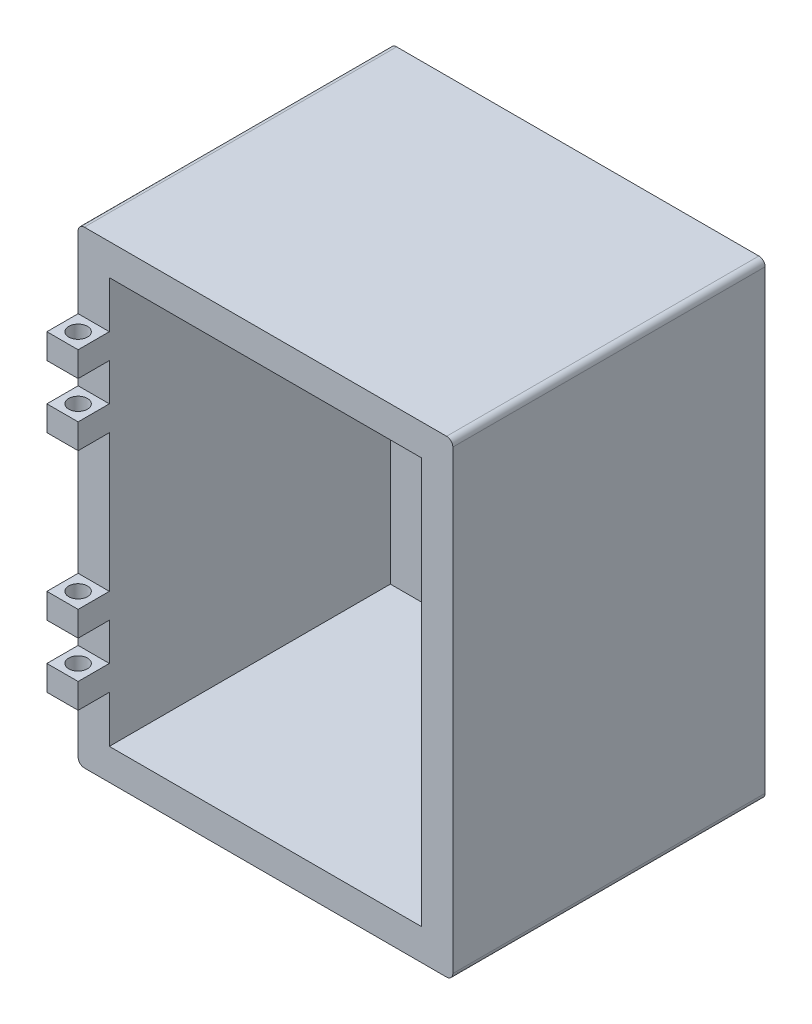
ISO-10303-21;
HEADER;
FILE_DESCRIPTION(('STEP AP214'),'2;1');
FILE_NAME('part.step','',(''),(''),'','','');
FILE_SCHEMA(('AUTOMOTIVE_DESIGN { 1 0 10303 214 1 1 1 1 }'));
ENDSEC;
DATA;
#1=APPLICATION_CONTEXT('core data for automotive mechanical design processes');
#2=APPLICATION_PROTOCOL_DEFINITION('international standard','automotive_design',2000,#1);
#3=PRODUCT_CONTEXT('',#1,'mechanical');
#4=PRODUCT('Part','Part','',(#3));
#5=PRODUCT_RELATED_PRODUCT_CATEGORY('part','',(#4));
#6=PRODUCT_DEFINITION_FORMATION('','',#4);
#7=PRODUCT_DEFINITION_CONTEXT('part definition',#1,'design');
#8=PRODUCT_DEFINITION('design','',#6,#7);
#9=PRODUCT_DEFINITION_SHAPE('','',#8);
#10=(LENGTH_UNIT() NAMED_UNIT(*) SI_UNIT(.MILLI.,.METRE.));
#11=(NAMED_UNIT(*) PLANE_ANGLE_UNIT() SI_UNIT($,.RADIAN.));
#12=(NAMED_UNIT(*) SI_UNIT($,.STERADIAN.) SOLID_ANGLE_UNIT());
#13=UNCERTAINTY_MEASURE_WITH_UNIT(LENGTH_MEASURE(1.E-05),#10,'distance_accuracy_value','');
#14=(GEOMETRIC_REPRESENTATION_CONTEXT(3) GLOBAL_UNCERTAINTY_ASSIGNED_CONTEXT((#13)) GLOBAL_UNIT_ASSIGNED_CONTEXT((#10,
#11,#12)) REPRESENTATION_CONTEXT('',''));
#15=CARTESIAN_POINT('',(0.,0.,0.));
#16=DIRECTION('',(0.,0.,1.));
#17=DIRECTION('',(1.,0.,0.));
#18=AXIS2_PLACEMENT_3D('',#15,#16,#17);
#19=CARTESIAN_POINT('',(0.,0.,100.));
#20=DIRECTION('',(0.,0.,-1.));
#21=DIRECTION('',(-1.,0.,0.));
#22=AXIS2_PLACEMENT_3D('',#19,#20,#21);
#23=PLANE('',#22);
#24=DIRECTION('',(-1.,0.,0.));
#25=VECTOR('',#24,1.);
#26=CARTESIAN_POINT('',(0.,53.,100.));
#27=LINE('',#26,#25);
#28=CARTESIAN_POINT('',(9.99999999999999,53.,100.));
#29=VERTEX_POINT('',#28);
#30=CARTESIAN_POINT('',(0.,53.,100.));
#31=VERTEX_POINT('',#30);
#32=EDGE_CURVE('E232',#29,#31,#27,.T.);
#33=ORIENTED_EDGE('',*,*,#32,.F.);
#34=DIRECTION('',(0.,-1.,0.));
#35=VECTOR('',#34,1.);
#36=CARTESIAN_POINT('',(10.,0.,100.));
#37=LINE('',#36,#35);
#38=CARTESIAN_POINT('',(9.99999999999999,97.,100.));
#39=VERTEX_POINT('',#38);
#40=EDGE_CURVE('E243',#39,#29,#37,.T.);
#41=ORIENTED_EDGE('',*,*,#40,.F.);
#42=DIRECTION('',(1.,0.,0.));
#43=VECTOR('',#42,1.);
#44=CARTESIAN_POINT('',(0.,97.,100.));
#45=LINE('',#44,#43);
#46=CARTESIAN_POINT('',(0.,97.,100.));
#47=VERTEX_POINT('',#46);
#48=EDGE_CURVE('E394',#47,#39,#45,.T.);
#49=ORIENTED_EDGE('',*,*,#48,.F.);
#50=DIRECTION('',(0.,-1.,0.));
#51=VECTOR('',#50,1.);
#52=CARTESIAN_POINT('',(0.,0.,100.));
#53=LINE('',#52,#51);
#54=EDGE_CURVE('E246',#47,#31,#53,.T.);
#55=ORIENTED_EDGE('',*,*,#54,.T.);
#56=EDGE_LOOP('',(#33,#41,#49,#55));
#57=FACE_BOUND('',#56,.T.);
#58=ADVANCED_FACE('F41',(#57),#23,.F.);
#59=DIRECTION('',(1.,0.,0.));
#60=VECTOR('',#59,1.);
#61=CARTESIAN_POINT('',(0.,45.,100.));
#62=LINE('',#61,#60);
#63=CARTESIAN_POINT('',(0.,45.,100.));
#64=VERTEX_POINT('',#63);
#65=CARTESIAN_POINT('',(10.,45.,100.));
#66=VERTEX_POINT('',#65);
#67=EDGE_CURVE('E248',#64,#66,#62,.T.);
#68=ORIENTED_EDGE('',*,*,#67,.F.);
#69=CARTESIAN_POINT('',(0.,33.,100.));
#70=VERTEX_POINT('',#69);
#71=EDGE_CURVE('E284',#64,#70,#53,.T.);
#72=ORIENTED_EDGE('',*,*,#71,.T.);
#73=DIRECTION('',(-1.,0.,0.));
#74=VECTOR('',#73,1.);
#75=CARTESIAN_POINT('',(0.,33.,100.));
#76=LINE('',#75,#74);
#77=CARTESIAN_POINT('',(9.99999999999999,33.,100.));
#78=VERTEX_POINT('',#77);
#79=EDGE_CURVE('E502',#78,#70,#76,.T.);
#80=ORIENTED_EDGE('',*,*,#79,.F.);
#81=EDGE_CURVE('E257',#66,#78,#37,.T.);
#82=ORIENTED_EDGE('',*,*,#81,.F.);
#83=EDGE_LOOP('',(#68,#72,#80,#82));
#84=FACE_BOUND('',#83,.T.);
#85=ADVANCED_FACE('F470',(#84),#23,.F.);
#86=DIRECTION('',(1.,0.,0.));
#87=VECTOR('',#86,1.);
#88=CARTESIAN_POINT('',(0.,0.,100.));
#89=LINE('',#88,#87);
#90=CARTESIAN_POINT('',(2.,0.,100.));
#91=VERTEX_POINT('',#90);
#92=CARTESIAN_POINT('',(118.,0.,100.));
#93=VERTEX_POINT('',#92);
#94=EDGE_CURVE('E282',#91,#93,#89,.T.);
#95=ORIENTED_EDGE('',*,*,#94,.T.);
#96=CARTESIAN_POINT('',(118.,2.,100.));
#97=DIRECTION('',(0.,0.,-1.));
#98=DIRECTION('',(-1.,0.,0.));
#99=AXIS2_PLACEMENT_3D('',#96,#97,#98);
#100=CIRCLE('',#99,2.);
#101=CARTESIAN_POINT('',(120.,2.,100.));
#102=VERTEX_POINT('',#101);
#103=EDGE_CURVE('E333',#93,#102,#100,.F.);
#104=ORIENTED_EDGE('',*,*,#103,.T.);
#105=DIRECTION('',(0.,1.,0.));
#106=VECTOR('',#105,1.);
#107=CARTESIAN_POINT('',(120.,0.,100.));
#108=LINE('',#107,#106);
#109=CARTESIAN_POINT('',(120.,148.,100.));
#110=VERTEX_POINT('',#109);
#111=EDGE_CURVE('E287',#102,#110,#108,.T.);
#112=ORIENTED_EDGE('',*,*,#111,.T.);
#113=CARTESIAN_POINT('',(118.,148.,100.));
#114=DIRECTION('',(0.,0.,-1.));
#115=DIRECTION('',(-1.,0.,0.));
#116=AXIS2_PLACEMENT_3D('',#113,#114,#115);
#117=CIRCLE('',#116,2.);
#118=CARTESIAN_POINT('',(118.,150.,100.));
#119=VERTEX_POINT('',#118);
#120=EDGE_CURVE('E329',#110,#119,#117,.F.);
#121=ORIENTED_EDGE('',*,*,#120,.T.);
#122=DIRECTION('',(-1.,0.,0.));
#123=VECTOR('',#122,1.);
#124=CARTESIAN_POINT('',(0.,150.,100.));
#125=LINE('',#124,#123);
#126=CARTESIAN_POINT('',(2.,150.,100.));
#127=VERTEX_POINT('',#126);
#128=EDGE_CURVE('E290',#119,#127,#125,.T.);
#129=ORIENTED_EDGE('',*,*,#128,.T.);
#130=CARTESIAN_POINT('',(2.,148.,100.));
#131=DIRECTION('',(0.,0.,-1.));
#132=DIRECTION('',(-1.,0.,0.));
#133=AXIS2_PLACEMENT_3D('',#130,#131,#132);
#134=CIRCLE('',#133,2.);
#135=CARTESIAN_POINT('',(0.,148.,100.));
#136=VERTEX_POINT('',#135);
#137=EDGE_CURVE('E56',#127,#136,#134,.F.);
#138=ORIENTED_EDGE('',*,*,#137,.T.);
#139=CARTESIAN_POINT('',(0.,125.,100.));
#140=VERTEX_POINT('',#139);
#141=EDGE_CURVE('E280',#136,#140,#53,.T.);
#142=ORIENTED_EDGE('',*,*,#141,.T.);
#143=DIRECTION('',(-1.,0.,0.));
#144=VECTOR('',#143,1.);
#145=CARTESIAN_POINT('',(0.,125.,100.));
#146=LINE('',#145,#144);
#147=CARTESIAN_POINT('',(9.99999999999999,125.,100.));
#148=VERTEX_POINT('',#147);
#149=EDGE_CURVE('E385',#148,#140,#146,.T.);
#150=ORIENTED_EDGE('',*,*,#149,.F.);
#151=CARTESIAN_POINT('',(10.,140.,100.));
#152=VERTEX_POINT('',#151);
#153=EDGE_CURVE('E259',#152,#148,#37,.T.);
#154=ORIENTED_EDGE('',*,*,#153,.F.);
#155=DIRECTION('',(-1.,0.,0.));
#156=VECTOR('',#155,1.);
#157=CARTESIAN_POINT('',(0.,140.,100.));
#158=LINE('',#157,#156);
#159=CARTESIAN_POINT('',(110.,140.,100.));
#160=VERTEX_POINT('',#159);
#161=EDGE_CURVE('E275',#160,#152,#158,.T.);
#162=ORIENTED_EDGE('',*,*,#161,.F.);
#163=DIRECTION('',(0.,1.,0.));
#164=VECTOR('',#163,1.);
#165=CARTESIAN_POINT('',(110.,0.,100.));
#166=LINE('',#165,#164);
#167=CARTESIAN_POINT('',(110.,10.,100.));
#168=VERTEX_POINT('',#167);
#169=EDGE_CURVE('E268',#168,#160,#166,.T.);
#170=ORIENTED_EDGE('',*,*,#169,.F.);
#171=DIRECTION('',(1.,0.,0.));
#172=VECTOR('',#171,1.);
#173=CARTESIAN_POINT('',(0.,10.,100.));
#174=LINE('',#173,#172);
#175=CARTESIAN_POINT('',(10.,10.,100.));
#176=VERTEX_POINT('',#175);
#177=EDGE_CURVE('E264',#176,#168,#174,.T.);
#178=ORIENTED_EDGE('',*,*,#177,.F.);
#179=CARTESIAN_POINT('',(10.,25.,100.));
#180=VERTEX_POINT('',#179);
#181=EDGE_CURVE('E260',#180,#176,#37,.T.);
#182=ORIENTED_EDGE('',*,*,#181,.F.);
#183=DIRECTION('',(1.,0.,0.));
#184=VECTOR('',#183,1.);
#185=CARTESIAN_POINT('',(0.,25.,100.));
#186=LINE('',#185,#184);
#187=CARTESIAN_POINT('',(0.,25.,100.));
#188=VERTEX_POINT('',#187);
#189=EDGE_CURVE('E353',#188,#180,#186,.T.);
#190=ORIENTED_EDGE('',*,*,#189,.F.);
#191=CARTESIAN_POINT('',(0.,2.,100.));
#192=VERTEX_POINT('',#191);
#193=EDGE_CURVE('E305',#188,#192,#53,.T.);
#194=ORIENTED_EDGE('',*,*,#193,.T.);
#195=CARTESIAN_POINT('',(2.,2.,100.));
#196=DIRECTION('',(0.,0.,-1.));
#197=DIRECTION('',(-1.,0.,0.));
#198=AXIS2_PLACEMENT_3D('',#195,#196,#197);
#199=CIRCLE('',#198,2.);
#200=EDGE_CURVE('E331',#192,#91,#199,.F.);
#201=ORIENTED_EDGE('',*,*,#200,.T.);
#202=EDGE_LOOP('',(#95,#104,#112,#121,#129,#138,#142,#150,#154,#162,#170,#178,#182,#190,#194,#201));
#203=FACE_BOUND('',#202,.T.);
#204=ADVANCED_FACE('F349',(#203),#23,.F.);
#205=DIRECTION('',(1.,0.,0.));
#206=VECTOR('',#205,1.);
#207=CARTESIAN_POINT('',(0.,117.,100.));
#208=LINE('',#207,#206);
#209=CARTESIAN_POINT('',(0.,117.,100.));
#210=VERTEX_POINT('',#209);
#211=CARTESIAN_POINT('',(10.,117.,100.));
#212=VERTEX_POINT('',#211);
#213=EDGE_CURVE('E390',#210,#212,#208,.T.);
#214=ORIENTED_EDGE('',*,*,#213,.F.);
#215=CARTESIAN_POINT('',(0.,105.,100.));
#216=VERTEX_POINT('',#215);
#217=EDGE_CURVE('E283',#210,#216,#53,.T.);
#218=ORIENTED_EDGE('',*,*,#217,.T.);
#219=DIRECTION('',(-1.,0.,0.));
#220=VECTOR('',#219,1.);
#221=CARTESIAN_POINT('',(0.,105.,100.));
#222=LINE('',#221,#220);
#223=CARTESIAN_POINT('',(10.,105.,100.));
#224=VERTEX_POINT('',#223);
#225=EDGE_CURVE('E411',#224,#216,#222,.T.);
#226=ORIENTED_EDGE('',*,*,#225,.F.);
#227=EDGE_CURVE('E256',#212,#224,#37,.T.);
#228=ORIENTED_EDGE('',*,*,#227,.F.);
#229=EDGE_LOOP('',(#214,#218,#226,#228));
#230=FACE_BOUND('',#229,.T.);
#231=ADVANCED_FACE('F472',(#230),#23,.F.);
#232=CARTESIAN_POINT('',(0.,0.,100.));
#233=DIRECTION('',(1.,0.,0.));
#234=DIRECTION('',(0.,0.,-1.));
#235=AXIS2_PLACEMENT_3D('',#232,#233,#234);
#236=PLANE('',#235);
#237=DIRECTION('',(0.,-1.,0.));
#238=VECTOR('',#237,1.);
#239=CARTESIAN_POINT('',(0.,0.,0.));
#240=LINE('',#239,#238);
#241=CARTESIAN_POINT('',(0.,148.,0.));
#242=VERTEX_POINT('',#241);
#243=CARTESIAN_POINT('',(0.,2.,0.));
#244=VERTEX_POINT('',#243);
#245=EDGE_CURVE('E293',#242,#244,#240,.T.);
#246=ORIENTED_EDGE('',*,*,#245,.T.);
#247=DIRECTION('',(0.,0.,-1.));
#248=VECTOR('',#247,1.);
#249=CARTESIAN_POINT('',(0.,2.,100.));
#250=LINE('',#249,#248);
#251=EDGE_CURVE('E338',#244,#192,#250,.F.);
#252=ORIENTED_EDGE('',*,*,#251,.T.);
#253=ORIENTED_EDGE('',*,*,#193,.F.);
#254=DIRECTION('',(0.,0.,-1.));
#255=VECTOR('',#254,1.);
#256=CARTESIAN_POINT('',(0.,25.,110.));
#257=LINE('',#256,#255);
#258=CARTESIAN_POINT('',(0.,25.,110.));
#259=VERTEX_POINT('',#258);
#260=EDGE_CURVE('E510',#259,#188,#257,.T.);
#261=ORIENTED_EDGE('',*,*,#260,.F.);
#262=DIRECTION('',(0.,-1.,0.));
#263=VECTOR('',#262,1.);
#264=CARTESIAN_POINT('',(0.,33.,110.));
#265=LINE('',#264,#263);
#266=CARTESIAN_POINT('',(0.,33.,110.));
#267=VERTEX_POINT('',#266);
#268=EDGE_CURVE('E506',#267,#259,#265,.T.);
#269=ORIENTED_EDGE('',*,*,#268,.F.);
#270=DIRECTION('',(0.,0.,-1.));
#271=VECTOR('',#270,1.);
#272=CARTESIAN_POINT('',(0.,33.,110.));
#273=LINE('',#272,#271);
#274=EDGE_CURVE('E247',#267,#70,#273,.T.);
#275=ORIENTED_EDGE('',*,*,#274,.T.);
#276=ORIENTED_EDGE('',*,*,#71,.F.);
#277=DIRECTION('',(0.,0.,-1.));
#278=VECTOR('',#277,1.);
#279=CARTESIAN_POINT('',(0.,45.,110.));
#280=LINE('',#279,#278);
#281=CARTESIAN_POINT('',(0.,45.,110.));
#282=VERTEX_POINT('',#281);
#283=EDGE_CURVE('E834',#282,#64,#280,.T.);
#284=ORIENTED_EDGE('',*,*,#283,.F.);
#285=DIRECTION('',(0.,-1.,0.));
#286=VECTOR('',#285,1.);
#287=CARTESIAN_POINT('',(0.,53.,110.));
#288=LINE('',#287,#286);
#289=CARTESIAN_POINT('',(0.,53.,110.));
#290=VERTEX_POINT('',#289);
#291=EDGE_CURVE('E846',#290,#282,#288,.T.);
#292=ORIENTED_EDGE('',*,*,#291,.F.);
#293=DIRECTION('',(0.,0.,-1.));
#294=VECTOR('',#293,1.);
#295=CARTESIAN_POINT('',(0.,53.,110.));
#296=LINE('',#295,#294);
#297=EDGE_CURVE('E832',#290,#31,#296,.T.);
#298=ORIENTED_EDGE('',*,*,#297,.T.);
#299=ORIENTED_EDGE('',*,*,#54,.F.);
#300=DIRECTION('',(0.,0.,-1.));
#301=VECTOR('',#300,1.);
#302=CARTESIAN_POINT('',(0.,97.,110.));
#303=LINE('',#302,#301);
#304=CARTESIAN_POINT('',(0.,97.,110.));
#305=VERTEX_POINT('',#304);
#306=EDGE_CURVE('E427',#305,#47,#303,.T.);
#307=ORIENTED_EDGE('',*,*,#306,.F.);
#308=DIRECTION('',(0.,-1.,0.));
#309=VECTOR('',#308,1.);
#310=CARTESIAN_POINT('',(0.,97.,110.));
#311=LINE('',#310,#309);
#312=CARTESIAN_POINT('',(0.,105.,110.));
#313=VERTEX_POINT('',#312);
#314=EDGE_CURVE('E407',#313,#305,#311,.T.);
#315=ORIENTED_EDGE('',*,*,#314,.F.);
#316=DIRECTION('',(0.,0.,-1.));
#317=VECTOR('',#316,1.);
#318=CARTESIAN_POINT('',(0.,105.,110.));
#319=LINE('',#318,#317);
#320=EDGE_CURVE('E417',#313,#216,#319,.T.);
#321=ORIENTED_EDGE('',*,*,#320,.T.);
#322=ORIENTED_EDGE('',*,*,#217,.F.);
#323=DIRECTION('',(0.,0.,-1.));
#324=VECTOR('',#323,1.);
#325=CARTESIAN_POINT('',(0.,117.,110.));
#326=LINE('',#325,#324);
#327=CARTESIAN_POINT('',(0.,117.,110.));
#328=VERTEX_POINT('',#327);
#329=EDGE_CURVE('E493',#328,#210,#326,.T.);
#330=ORIENTED_EDGE('',*,*,#329,.F.);
#331=DIRECTION('',(0.,-1.,0.));
#332=VECTOR('',#331,1.);
#333=CARTESIAN_POINT('',(0.,117.,110.));
#334=LINE('',#333,#332);
#335=CARTESIAN_POINT('',(0.,125.,110.));
#336=VERTEX_POINT('',#335);
#337=EDGE_CURVE('E391',#336,#328,#334,.T.);
#338=ORIENTED_EDGE('',*,*,#337,.F.);
#339=DIRECTION('',(0.,0.,-1.));
#340=VECTOR('',#339,1.);
#341=CARTESIAN_POINT('',(0.,125.,110.));
#342=LINE('',#341,#340);
#343=EDGE_CURVE('E382',#336,#140,#342,.T.);
#344=ORIENTED_EDGE('',*,*,#343,.T.);
#345=ORIENTED_EDGE('',*,*,#141,.F.);
#346=DIRECTION('',(0.,0.,-1.));
#347=VECTOR('',#346,1.);
#348=CARTESIAN_POINT('',(0.,148.,100.));
#349=LINE('',#348,#347);
#350=EDGE_CURVE('E335',#136,#242,#349,.T.);
#351=ORIENTED_EDGE('',*,*,#350,.T.);
#352=EDGE_LOOP('',(#246,#252,#253,#261,#269,#275,#276,#284,#292,#298,#299,#307,#315,#321,#322,
#330,#338,#344,#345,#351));
#353=FACE_BOUND('',#352,.T.);
#354=ADVANCED_FACE('F343',(#353),#236,.F.);
#355=CARTESIAN_POINT('',(0.,0.,100.));
#356=DIRECTION('',(0.,1.,0.));
#357=DIRECTION('',(0.,0.,1.));
#358=AXIS2_PLACEMENT_3D('',#355,#356,#357);
#359=PLANE('',#358);
#360=DIRECTION('',(1.,0.,0.));
#361=VECTOR('',#360,1.);
#362=CARTESIAN_POINT('',(0.,0.,0.));
#363=LINE('',#362,#361);
#364=CARTESIAN_POINT('',(2.,0.,0.));
#365=VERTEX_POINT('',#364);
#366=CARTESIAN_POINT('',(118.,0.,0.));
#367=VERTEX_POINT('',#366);
#368=EDGE_CURVE('E296',#365,#367,#363,.T.);
#369=ORIENTED_EDGE('',*,*,#368,.T.);
#370=DIRECTION('',(0.,0.,-1.));
#371=VECTOR('',#370,1.);
#372=CARTESIAN_POINT('',(118.,0.,100.));
#373=LINE('',#372,#371);
#374=EDGE_CURVE('E326',#367,#93,#373,.F.);
#375=ORIENTED_EDGE('',*,*,#374,.T.);
#376=ORIENTED_EDGE('',*,*,#94,.F.);
#377=DIRECTION('',(0.,0.,-1.));
#378=VECTOR('',#377,1.);
#379=CARTESIAN_POINT('',(2.,0.,100.));
#380=LINE('',#379,#378);
#381=EDGE_CURVE('E323',#91,#365,#380,.T.);
#382=ORIENTED_EDGE('',*,*,#381,.T.);
#383=EDGE_LOOP('',(#369,#375,#376,#382));
#384=FACE_BOUND('',#383,.T.);
#385=ADVANCED_FACE('F358',(#384),#359,.F.);
#386=CARTESIAN_POINT('',(120.,0.,100.));
#387=DIRECTION('',(-1.,0.,0.));
#388=DIRECTION('',(0.,0.,1.));
#389=AXIS2_PLACEMENT_3D('',#386,#387,#388);
#390=PLANE('',#389);
#391=ORIENTED_EDGE('',*,*,#111,.F.);
#392=DIRECTION('',(0.,0.,-1.));
#393=VECTOR('',#392,1.);
#394=CARTESIAN_POINT('',(120.,2.,100.));
#395=LINE('',#394,#393);
#396=CARTESIAN_POINT('',(120.,2.,0.));
#397=VERTEX_POINT('',#396);
#398=EDGE_CURVE('E312',#102,#397,#395,.T.);
#399=ORIENTED_EDGE('',*,*,#398,.T.);
#400=DIRECTION('',(0.,1.,0.));
#401=VECTOR('',#400,1.);
#402=CARTESIAN_POINT('',(120.,0.,0.));
#403=LINE('',#402,#401);
#404=CARTESIAN_POINT('',(120.,148.,0.));
#405=VERTEX_POINT('',#404);
#406=EDGE_CURVE('E300',#397,#405,#403,.T.);
#407=ORIENTED_EDGE('',*,*,#406,.T.);
#408=DIRECTION('',(0.,0.,-1.));
#409=VECTOR('',#408,1.);
#410=CARTESIAN_POINT('',(120.,148.,100.));
#411=LINE('',#410,#409);
#412=EDGE_CURVE('E292',#405,#110,#411,.F.);
#413=ORIENTED_EDGE('',*,*,#412,.T.);
#414=EDGE_LOOP('',(#391,#399,#407,#413));
#415=FACE_BOUND('',#414,.T.);
#416=ADVANCED_FACE('F369',(#415),#390,.F.);
#417=CARTESIAN_POINT('',(0.,150.,100.));
#418=DIRECTION('',(0.,-1.,0.));
#419=DIRECTION('',(0.,0.,-1.));
#420=AXIS2_PLACEMENT_3D('',#417,#418,#419);
#421=PLANE('',#420);
#422=ORIENTED_EDGE('',*,*,#128,.F.);
#423=DIRECTION('',(0.,0.,-1.));
#424=VECTOR('',#423,1.);
#425=CARTESIAN_POINT('',(118.,150.,100.));
#426=LINE('',#425,#424);
#427=CARTESIAN_POINT('',(118.,150.,0.));
#428=VERTEX_POINT('',#427);
#429=EDGE_CURVE('E11',#119,#428,#426,.T.);
#430=ORIENTED_EDGE('',*,*,#429,.T.);
#431=DIRECTION('',(-1.,0.,0.));
#432=VECTOR('',#431,1.);
#433=CARTESIAN_POINT('',(0.,150.,0.));
#434=LINE('',#433,#432);
#435=CARTESIAN_POINT('',(2.,150.,0.));
#436=VERTEX_POINT('',#435);
#437=EDGE_CURVE('E303',#428,#436,#434,.T.);
#438=ORIENTED_EDGE('',*,*,#437,.T.);
#439=DIRECTION('',(0.,0.,-1.));
#440=VECTOR('',#439,1.);
#441=CARTESIAN_POINT('',(2.,150.,100.));
#442=LINE('',#441,#440);
#443=EDGE_CURVE('E49',#436,#127,#442,.F.);
#444=ORIENTED_EDGE('',*,*,#443,.T.);
#445=EDGE_LOOP('',(#422,#430,#438,#444));
#446=FACE_BOUND('',#445,.T.);
#447=ADVANCED_FACE('F376',(#446),#421,.F.);
#448=CARTESIAN_POINT('',(0.,0.,0.));
#449=DIRECTION('',(0.,0.,-1.));
#450=DIRECTION('',(-1.,0.,0.));
#451=AXIS2_PLACEMENT_3D('',#448,#449,#450);
#452=PLANE('',#451);
#453=ORIENTED_EDGE('',*,*,#406,.F.);
#454=CARTESIAN_POINT('',(118.,2.,0.));
#455=DIRECTION('',(0.,0.,-1.));
#456=DIRECTION('',(-1.,0.,0.));
#457=AXIS2_PLACEMENT_3D('',#454,#455,#456);
#458=CIRCLE('',#457,2.);
#459=EDGE_CURVE('E321',#397,#367,#458,.T.);
#460=ORIENTED_EDGE('',*,*,#459,.T.);
#461=ORIENTED_EDGE('',*,*,#368,.F.);
#462=CARTESIAN_POINT('',(2.,2.,0.));
#463=DIRECTION('',(0.,0.,-1.));
#464=DIRECTION('',(-1.,0.,0.));
#465=AXIS2_PLACEMENT_3D('',#462,#463,#464);
#466=CIRCLE('',#465,2.);
#467=EDGE_CURVE('E319',#365,#244,#466,.T.);
#468=ORIENTED_EDGE('',*,*,#467,.T.);
#469=ORIENTED_EDGE('',*,*,#245,.F.);
#470=CARTESIAN_POINT('',(2.,148.,0.));
#471=DIRECTION('',(0.,0.,-1.));
#472=DIRECTION('',(-1.,0.,0.));
#473=AXIS2_PLACEMENT_3D('',#470,#471,#472);
#474=CIRCLE('',#473,2.);
#475=EDGE_CURVE('E315',#242,#436,#474,.T.);
#476=ORIENTED_EDGE('',*,*,#475,.T.);
#477=ORIENTED_EDGE('',*,*,#437,.F.);
#478=CARTESIAN_POINT('',(118.,148.,0.));
#479=DIRECTION('',(0.,0.,-1.));
#480=DIRECTION('',(-1.,0.,0.));
#481=AXIS2_PLACEMENT_3D('',#478,#479,#480);
#482=CIRCLE('',#481,2.);
#483=EDGE_CURVE('E317',#428,#405,#482,.T.);
#484=ORIENTED_EDGE('',*,*,#483,.T.);
#485=EDGE_LOOP('',(#453,#460,#461,#468,#469,#476,#477,#484));
#486=FACE_BOUND('',#485,.T.);
#487=ADVANCED_FACE('F362',(#486),#452,.T.);
#488=CARTESIAN_POINT('',(10.,0.,100.));
#489=DIRECTION('',(1.,0.,0.));
#490=DIRECTION('',(0.,0.,-1.));
#491=AXIS2_PLACEMENT_3D('',#488,#489,#490);
#492=PLANE('',#491);
#493=DIRECTION('',(0.,-1.,0.));
#494=VECTOR('',#493,1.);
#495=CARTESIAN_POINT('',(10.,0.,10.));
#496=LINE('',#495,#494);
#497=CARTESIAN_POINT('',(10.,140.,10.));
#498=VERTEX_POINT('',#497);
#499=CARTESIAN_POINT('',(10.,10.,10.));
#500=VERTEX_POINT('',#499);
#501=EDGE_CURVE('E430',#498,#500,#496,.T.);
#502=ORIENTED_EDGE('',*,*,#501,.F.);
#503=DIRECTION('',(0.,0.,-1.));
#504=VECTOR('',#503,1.);
#505=CARTESIAN_POINT('',(10.,140.,100.));
#506=LINE('',#505,#504);
#507=EDGE_CURVE('E279',#152,#498,#506,.T.);
#508=ORIENTED_EDGE('',*,*,#507,.F.);
#509=ORIENTED_EDGE('',*,*,#153,.T.);
#510=DIRECTION('',(0.,0.,-1.));
#511=VECTOR('',#510,1.);
#512=CARTESIAN_POINT('',(9.99999999999999,125.,110.));
#513=LINE('',#512,#511);
#514=CARTESIAN_POINT('',(9.99999999999999,125.,110.));
#515=VERTEX_POINT('',#514);
#516=EDGE_CURVE('E389',#515,#148,#513,.T.);
#517=ORIENTED_EDGE('',*,*,#516,.F.);
#518=DIRECTION('',(0.,1.,0.));
#519=VECTOR('',#518,1.);
#520=CARTESIAN_POINT('',(9.99999999999999,117.,110.));
#521=LINE('',#520,#519);
#522=CARTESIAN_POINT('',(9.99999999999999,117.,110.));
#523=VERTEX_POINT('',#522);
#524=EDGE_CURVE('E404',#523,#515,#521,.T.);
#525=ORIENTED_EDGE('',*,*,#524,.F.);
#526=DIRECTION('',(0.,0.,-1.));
#527=VECTOR('',#526,1.);
#528=CARTESIAN_POINT('',(9.99999999999999,117.,110.));
#529=LINE('',#528,#527);
#530=EDGE_CURVE('E517',#523,#212,#529,.T.);
#531=ORIENTED_EDGE('',*,*,#530,.T.);
#532=ORIENTED_EDGE('',*,*,#227,.T.);
#533=DIRECTION('',(0.,0.,-1.));
#534=VECTOR('',#533,1.);
#535=CARTESIAN_POINT('',(9.99999999999999,105.,110.));
#536=LINE('',#535,#534);
#537=CARTESIAN_POINT('',(9.99999999999999,105.,110.));
#538=VERTEX_POINT('',#537);
#539=EDGE_CURVE('E423',#538,#224,#536,.T.);
#540=ORIENTED_EDGE('',*,*,#539,.F.);
#541=DIRECTION('',(0.,1.,0.));
#542=VECTOR('',#541,1.);
#543=CARTESIAN_POINT('',(9.99999999999999,97.,110.));
#544=LINE('',#543,#542);
#545=CARTESIAN_POINT('',(9.99999999999999,97.,110.));
#546=VERTEX_POINT('',#545);
#547=EDGE_CURVE('E413',#546,#538,#544,.T.);
#548=ORIENTED_EDGE('',*,*,#547,.F.);
#549=DIRECTION('',(0.,0.,-1.));
#550=VECTOR('',#549,1.);
#551=CARTESIAN_POINT('',(9.99999999999999,97.,110.));
#552=LINE('',#551,#550);
#553=EDGE_CURVE('E255',#546,#39,#552,.T.);
#554=ORIENTED_EDGE('',*,*,#553,.T.);
#555=ORIENTED_EDGE('',*,*,#40,.T.);
#556=DIRECTION('',(0.,0.,-1.));
#557=VECTOR('',#556,1.);
#558=CARTESIAN_POINT('',(9.99999999999999,53.,110.));
#559=LINE('',#558,#557);
#560=CARTESIAN_POINT('',(9.99999999999999,53.,110.));
#561=VERTEX_POINT('',#560);
#562=EDGE_CURVE('E228',#561,#29,#559,.T.);
#563=ORIENTED_EDGE('',*,*,#562,.F.);
#564=DIRECTION('',(0.,1.,0.));
#565=VECTOR('',#564,1.);
#566=CARTESIAN_POINT('',(9.99999999999999,53.,110.));
#567=LINE('',#566,#565);
#568=CARTESIAN_POINT('',(9.99999999999999,45.,110.));
#569=VERTEX_POINT('',#568);
#570=EDGE_CURVE('E239',#569,#561,#567,.T.);
#571=ORIENTED_EDGE('',*,*,#570,.F.);
#572=DIRECTION('',(0.,0.,-1.));
#573=VECTOR('',#572,1.);
#574=CARTESIAN_POINT('',(9.99999999999999,45.,110.));
#575=LINE('',#574,#573);
#576=EDGE_CURVE('E240',#569,#66,#575,.T.);
#577=ORIENTED_EDGE('',*,*,#576,.T.);
#578=ORIENTED_EDGE('',*,*,#81,.T.);
#579=DIRECTION('',(0.,0.,-1.));
#580=VECTOR('',#579,1.);
#581=CARTESIAN_POINT('',(9.99999999999999,33.,110.));
#582=LINE('',#581,#580);
#583=CARTESIAN_POINT('',(9.99999999999999,33.,110.));
#584=VERTEX_POINT('',#583);
#585=EDGE_CURVE('E515',#584,#78,#582,.T.);
#586=ORIENTED_EDGE('',*,*,#585,.F.);
#587=DIRECTION('',(0.,1.,0.));
#588=VECTOR('',#587,1.);
#589=CARTESIAN_POINT('',(9.99999999999999,33.,110.));
#590=LINE('',#589,#588);
#591=CARTESIAN_POINT('',(9.99999999999999,25.,110.));
#592=VERTEX_POINT('',#591);
#593=EDGE_CURVE('E523',#592,#584,#590,.T.);
#594=ORIENTED_EDGE('',*,*,#593,.F.);
#595=DIRECTION('',(0.,0.,-1.));
#596=VECTOR('',#595,1.);
#597=CARTESIAN_POINT('',(9.99999999999999,25.,110.));
#598=LINE('',#597,#596);
#599=EDGE_CURVE('E450',#592,#180,#598,.T.);
#600=ORIENTED_EDGE('',*,*,#599,.T.);
#601=ORIENTED_EDGE('',*,*,#181,.T.);
#602=DIRECTION('',(0.,0.,-1.));
#603=VECTOR('',#602,1.);
#604=CARTESIAN_POINT('',(10.,10.,100.));
#605=LINE('',#604,#603);
#606=EDGE_CURVE('E297',#176,#500,#605,.T.);
#607=ORIENTED_EDGE('',*,*,#606,.T.);
#608=EDGE_LOOP('',(#502,#508,#509,#517,#525,#531,#532,#540,#548,#554,#555,#563,#571,#577,#578,
#586,#594,#600,#601,#607));
#609=FACE_BOUND('',#608,.T.);
#610=ADVANCED_FACE('F252',(#609),#492,.T.);
#611=CARTESIAN_POINT('',(0.,10.,100.));
#612=DIRECTION('',(0.,1.,0.));
#613=DIRECTION('',(0.,0.,1.));
#614=AXIS2_PLACEMENT_3D('',#611,#612,#613);
#615=PLANE('',#614);
#616=DIRECTION('',(1.,0.,0.));
#617=VECTOR('',#616,1.);
#618=CARTESIAN_POINT('',(0.,10.,10.));
#619=LINE('',#618,#617);
#620=CARTESIAN_POINT('',(110.,10.,10.));
#621=VERTEX_POINT('',#620);
#622=EDGE_CURVE('E433',#500,#621,#619,.T.);
#623=ORIENTED_EDGE('',*,*,#622,.F.);
#624=ORIENTED_EDGE('',*,*,#606,.F.);
#625=ORIENTED_EDGE('',*,*,#177,.T.);
#626=DIRECTION('',(0.,0.,-1.));
#627=VECTOR('',#626,1.);
#628=CARTESIAN_POINT('',(110.,10.,100.));
#629=LINE('',#628,#627);
#630=EDGE_CURVE('E436',#168,#621,#629,.T.);
#631=ORIENTED_EDGE('',*,*,#630,.T.);
#632=EDGE_LOOP('',(#623,#624,#625,#631));
#633=FACE_BOUND('',#632,.T.);
#634=ADVANCED_FACE('F451',(#633),#615,.T.);
#635=CARTESIAN_POINT('',(110.,0.,100.));
#636=DIRECTION('',(-1.,0.,0.));
#637=DIRECTION('',(0.,0.,1.));
#638=AXIS2_PLACEMENT_3D('',#635,#636,#637);
#639=PLANE('',#638);
#640=DIRECTION('',(0.,1.,0.));
#641=VECTOR('',#640,1.);
#642=CARTESIAN_POINT('',(110.,0.,10.));
#643=LINE('',#642,#641);
#644=CARTESIAN_POINT('',(110.,140.,10.));
#645=VERTEX_POINT('',#644);
#646=EDGE_CURVE('E441',#621,#645,#643,.T.);
#647=ORIENTED_EDGE('',*,*,#646,.F.);
#648=ORIENTED_EDGE('',*,*,#630,.F.);
#649=ORIENTED_EDGE('',*,*,#169,.T.);
#650=DIRECTION('',(0.,0.,-1.));
#651=VECTOR('',#650,1.);
#652=CARTESIAN_POINT('',(110.,140.,100.));
#653=LINE('',#652,#651);
#654=EDGE_CURVE('E439',#160,#645,#653,.T.);
#655=ORIENTED_EDGE('',*,*,#654,.T.);
#656=EDGE_LOOP('',(#647,#648,#649,#655));
#657=FACE_BOUND('',#656,.T.);
#658=ADVANCED_FACE('F456',(#657),#639,.T.);
#659=CARTESIAN_POINT('',(0.,140.,100.));
#660=DIRECTION('',(0.,-1.,0.));
#661=DIRECTION('',(0.,0.,-1.));
#662=AXIS2_PLACEMENT_3D('',#659,#660,#661);
#663=PLANE('',#662);
#664=DIRECTION('',(-1.,0.,0.));
#665=VECTOR('',#664,1.);
#666=CARTESIAN_POINT('',(0.,140.,10.));
#667=LINE('',#666,#665);
#668=EDGE_CURVE('E444',#645,#498,#667,.T.);
#669=ORIENTED_EDGE('',*,*,#668,.F.);
#670=ORIENTED_EDGE('',*,*,#654,.F.);
#671=ORIENTED_EDGE('',*,*,#161,.T.);
#672=ORIENTED_EDGE('',*,*,#507,.T.);
#673=EDGE_LOOP('',(#669,#670,#671,#672));
#674=FACE_BOUND('',#673,.T.);
#675=ADVANCED_FACE('F459',(#674),#663,.T.);
#676=CARTESIAN_POINT('',(0.,0.,10.));
#677=DIRECTION('',(0.,0.,-1.));
#678=DIRECTION('',(-1.,0.,0.));
#679=AXIS2_PLACEMENT_3D('',#676,#677,#678);
#680=PLANE('',#679);
#681=ORIENTED_EDGE('',*,*,#501,.T.);
#682=ORIENTED_EDGE('',*,*,#622,.T.);
#683=ORIENTED_EDGE('',*,*,#646,.T.);
#684=ORIENTED_EDGE('',*,*,#668,.T.);
#685=EDGE_LOOP('',(#681,#682,#683,#684));
#686=FACE_BOUND('',#685,.T.);
#687=ADVANCED_FACE('F457',(#686),#680,.F.);
#688=CARTESIAN_POINT('',(0.,97.,110.));
#689=DIRECTION('',(0.,1.,0.));
#690=DIRECTION('',(0.,0.,1.));
#691=AXIS2_PLACEMENT_3D('',#688,#689,#690);
#692=PLANE('',#691);
#693=CARTESIAN_POINT('',(5.,97.,105.));
#694=DIRECTION('',(0.,1.,0.));
#695=DIRECTION('',(0.,0.,1.));
#696=AXIS2_PLACEMENT_3D('',#693,#694,#695);
#697=CIRCLE('',#696,3.);
#698=CARTESIAN_POINT('',(5.,97.,108.));
#699=VERTEX_POINT('',#698);
#700=EDGE_CURVE('E831',#699,#699,#697,.T.);
#701=ORIENTED_EDGE('',*,*,#700,.T.);
#702=EDGE_LOOP('',(#701));
#703=FACE_BOUND('',#702,.T.);
#704=ORIENTED_EDGE('',*,*,#48,.T.);
#705=ORIENTED_EDGE('',*,*,#553,.F.);
#706=DIRECTION('',(1.,0.,0.));
#707=VECTOR('',#706,1.);
#708=CARTESIAN_POINT('',(0.,97.,110.));
#709=LINE('',#708,#707);
#710=EDGE_CURVE('E410',#305,#546,#709,.T.);
#711=ORIENTED_EDGE('',*,*,#710,.F.);
#712=ORIENTED_EDGE('',*,*,#306,.T.);
#713=EDGE_LOOP('',(#704,#705,#711,#712));
#714=FACE_BOUND('',#713,.T.);
#715=ADVANCED_FACE('F466',(#703,#714),#692,.F.);
#716=CARTESIAN_POINT('',(0.,105.,110.));
#717=DIRECTION('',(0.,-1.,0.));
#718=DIRECTION('',(0.,0.,-1.));
#719=AXIS2_PLACEMENT_3D('',#716,#717,#718);
#720=PLANE('',#719);
#721=CARTESIAN_POINT('',(5.,105.,105.));
#722=DIRECTION('',(0.,-1.,0.));
#723=DIRECTION('',(0.,0.,-1.));
#724=AXIS2_PLACEMENT_3D('',#721,#722,#723);
#725=CIRCLE('',#724,3.);
#726=CARTESIAN_POINT('',(5.,105.,102.));
#727=VERTEX_POINT('',#726);
#728=EDGE_CURVE('E828',#727,#727,#725,.T.);
#729=ORIENTED_EDGE('',*,*,#728,.T.);
#730=EDGE_LOOP('',(#729));
#731=FACE_BOUND('',#730,.T.);
#732=ORIENTED_EDGE('',*,*,#225,.T.);
#733=ORIENTED_EDGE('',*,*,#320,.F.);
#734=DIRECTION('',(-1.,0.,0.));
#735=VECTOR('',#734,1.);
#736=CARTESIAN_POINT('',(0.,105.,110.));
#737=LINE('',#736,#735);
#738=EDGE_CURVE('E415',#538,#313,#737,.T.);
#739=ORIENTED_EDGE('',*,*,#738,.F.);
#740=ORIENTED_EDGE('',*,*,#539,.T.);
#741=EDGE_LOOP('',(#732,#733,#739,#740));
#742=FACE_BOUND('',#741,.T.);
#743=ADVANCED_FACE('F551',(#731,#742),#720,.F.);
#744=CARTESIAN_POINT('',(0.,0.,110.));
#745=DIRECTION('',(0.,0.,-1.));
#746=DIRECTION('',(-1.,0.,0.));
#747=AXIS2_PLACEMENT_3D('',#744,#745,#746);
#748=PLANE('',#747);
#749=ORIENTED_EDGE('',*,*,#314,.T.);
#750=ORIENTED_EDGE('',*,*,#710,.T.);
#751=ORIENTED_EDGE('',*,*,#547,.T.);
#752=ORIENTED_EDGE('',*,*,#738,.T.);
#753=EDGE_LOOP('',(#749,#750,#751,#752));
#754=FACE_BOUND('',#753,.T.);
#755=ADVANCED_FACE('F549',(#754),#748,.F.);
#756=CARTESIAN_POINT('',(0.,117.,110.));
#757=DIRECTION('',(0.,1.,0.));
#758=DIRECTION('',(0.,0.,1.));
#759=AXIS2_PLACEMENT_3D('',#756,#757,#758);
#760=PLANE('',#759);
#761=CARTESIAN_POINT('',(5.,117.,105.));
#762=DIRECTION('',(0.,1.,0.));
#763=DIRECTION('',(0.,0.,1.));
#764=AXIS2_PLACEMENT_3D('',#761,#762,#763);
#765=CIRCLE('',#764,3.);
#766=CARTESIAN_POINT('',(5.,117.,108.));
#767=VERTEX_POINT('',#766);
#768=EDGE_CURVE('E836',#767,#767,#765,.T.);
#769=ORIENTED_EDGE('',*,*,#768,.T.);
#770=EDGE_LOOP('',(#769));
#771=FACE_BOUND('',#770,.T.);
#772=ORIENTED_EDGE('',*,*,#213,.T.);
#773=ORIENTED_EDGE('',*,*,#530,.F.);
#774=DIRECTION('',(1.,0.,0.));
#775=VECTOR('',#774,1.);
#776=CARTESIAN_POINT('',(0.,117.,110.));
#777=LINE('',#776,#775);
#778=EDGE_CURVE('E397',#328,#523,#777,.T.);
#779=ORIENTED_EDGE('',*,*,#778,.F.);
#780=ORIENTED_EDGE('',*,*,#329,.T.);
#781=EDGE_LOOP('',(#772,#773,#779,#780));
#782=FACE_BOUND('',#781,.T.);
#783=ADVANCED_FACE('F531',(#771,#782),#760,.F.);
#784=CARTESIAN_POINT('',(0.,125.,110.));
#785=DIRECTION('',(0.,-1.,0.));
#786=DIRECTION('',(0.,0.,-1.));
#787=AXIS2_PLACEMENT_3D('',#784,#785,#786);
#788=PLANE('',#787);
#789=CARTESIAN_POINT('',(5.,125.,105.));
#790=DIRECTION('',(0.,1.,0.));
#791=DIRECTION('',(0.,0.,1.));
#792=AXIS2_PLACEMENT_3D('',#789,#790,#791);
#793=CIRCLE('',#792,3.);
#794=CARTESIAN_POINT('',(5.,125.,108.));
#795=VERTEX_POINT('',#794);
#796=EDGE_CURVE('E310',#795,#795,#793,.T.);
#797=ORIENTED_EDGE('',*,*,#796,.F.);
#798=EDGE_LOOP('',(#797));
#799=FACE_BOUND('',#798,.T.);
#800=ORIENTED_EDGE('',*,*,#149,.T.);
#801=ORIENTED_EDGE('',*,*,#343,.F.);
#802=DIRECTION('',(-1.,0.,0.));
#803=VECTOR('',#802,1.);
#804=CARTESIAN_POINT('',(0.,125.,110.));
#805=LINE('',#804,#803);
#806=EDGE_CURVE('E402',#515,#336,#805,.T.);
#807=ORIENTED_EDGE('',*,*,#806,.F.);
#808=ORIENTED_EDGE('',*,*,#516,.T.);
#809=EDGE_LOOP('',(#800,#801,#807,#808));
#810=FACE_BOUND('',#809,.T.);
#811=ADVANCED_FACE('F387',(#799,#810),#788,.F.);
#812=CARTESIAN_POINT('',(0.,0.,110.));
#813=DIRECTION('',(0.,0.,-1.));
#814=DIRECTION('',(-1.,0.,0.));
#815=AXIS2_PLACEMENT_3D('',#812,#813,#814);
#816=PLANE('',#815);
#817=ORIENTED_EDGE('',*,*,#337,.T.);
#818=ORIENTED_EDGE('',*,*,#778,.T.);
#819=ORIENTED_EDGE('',*,*,#524,.T.);
#820=ORIENTED_EDGE('',*,*,#806,.T.);
#821=EDGE_LOOP('',(#817,#818,#819,#820));
#822=FACE_BOUND('',#821,.T.);
#823=ADVANCED_FACE('F533',(#822),#816,.F.);
#824=CARTESIAN_POINT('',(0.,33.,110.));
#825=DIRECTION('',(0.,-1.,0.));
#826=DIRECTION('',(0.,0.,-1.));
#827=AXIS2_PLACEMENT_3D('',#824,#825,#826);
#828=PLANE('',#827);
#829=CARTESIAN_POINT('',(5.,33.,105.));
#830=DIRECTION('',(0.,-1.,0.));
#831=DIRECTION('',(0.,0.,-1.));
#832=AXIS2_PLACEMENT_3D('',#829,#830,#831);
#833=CIRCLE('',#832,3.);
#834=CARTESIAN_POINT('',(5.,33.,102.));
#835=VERTEX_POINT('',#834);
#836=EDGE_CURVE('E861',#835,#835,#833,.T.);
#837=ORIENTED_EDGE('',*,*,#836,.T.);
#838=EDGE_LOOP('',(#837));
#839=FACE_BOUND('',#838,.T.);
#840=ORIENTED_EDGE('',*,*,#79,.T.);
#841=ORIENTED_EDGE('',*,*,#274,.F.);
#842=DIRECTION('',(-1.,0.,0.));
#843=VECTOR('',#842,1.);
#844=CARTESIAN_POINT('',(0.,33.,110.));
#845=LINE('',#844,#843);
#846=EDGE_CURVE('E519',#584,#267,#845,.T.);
#847=ORIENTED_EDGE('',*,*,#846,.F.);
#848=ORIENTED_EDGE('',*,*,#585,.T.);
#849=EDGE_LOOP('',(#840,#841,#847,#848));
#850=FACE_BOUND('',#849,.T.);
#851=ADVANCED_FACE('F513',(#839,#850),#828,.F.);
#852=CARTESIAN_POINT('',(0.,25.,110.));
#853=DIRECTION('',(0.,1.,0.));
#854=DIRECTION('',(0.,0.,1.));
#855=AXIS2_PLACEMENT_3D('',#852,#853,#854);
#856=PLANE('',#855);
#857=CARTESIAN_POINT('',(5.,25.,105.));
#858=DIRECTION('',(0.,1.,0.));
#859=DIRECTION('',(0.,0.,1.));
#860=AXIS2_PLACEMENT_3D('',#857,#858,#859);
#861=CIRCLE('',#860,3.);
#862=CARTESIAN_POINT('',(5.,25.,108.));
#863=VERTEX_POINT('',#862);
#864=EDGE_CURVE('E864',#863,#863,#861,.T.);
#865=ORIENTED_EDGE('',*,*,#864,.T.);
#866=EDGE_LOOP('',(#865));
#867=FACE_BOUND('',#866,.T.);
#868=ORIENTED_EDGE('',*,*,#189,.T.);
#869=ORIENTED_EDGE('',*,*,#599,.F.);
#870=DIRECTION('',(1.,0.,0.));
#871=VECTOR('',#870,1.);
#872=CARTESIAN_POINT('',(0.,25.,110.));
#873=LINE('',#872,#871);
#874=EDGE_CURVE('E525',#259,#592,#873,.T.);
#875=ORIENTED_EDGE('',*,*,#874,.F.);
#876=ORIENTED_EDGE('',*,*,#260,.T.);
#877=EDGE_LOOP('',(#868,#869,#875,#876));
#878=FACE_BOUND('',#877,.T.);
#879=ADVANCED_FACE('F541',(#867,#878),#856,.F.);
#880=CARTESIAN_POINT('',(0.,0.,110.));
#881=DIRECTION('',(0.,0.,-1.));
#882=DIRECTION('',(-1.,0.,0.));
#883=AXIS2_PLACEMENT_3D('',#880,#881,#882);
#884=PLANE('',#883);
#885=ORIENTED_EDGE('',*,*,#846,.T.);
#886=ORIENTED_EDGE('',*,*,#268,.T.);
#887=ORIENTED_EDGE('',*,*,#874,.T.);
#888=ORIENTED_EDGE('',*,*,#593,.T.);
#889=EDGE_LOOP('',(#885,#886,#887,#888));
#890=FACE_BOUND('',#889,.T.);
#891=ADVANCED_FACE('F688',(#890),#884,.F.);
#892=CARTESIAN_POINT('',(0.,53.,110.));
#893=DIRECTION('',(0.,-1.,0.));
#894=DIRECTION('',(0.,0.,-1.));
#895=AXIS2_PLACEMENT_3D('',#892,#893,#894);
#896=PLANE('',#895);
#897=CARTESIAN_POINT('',(5.,53.,105.));
#898=DIRECTION('',(0.,-1.,0.));
#899=DIRECTION('',(0.,0.,-1.));
#900=AXIS2_PLACEMENT_3D('',#897,#898,#899);
#901=CIRCLE('',#900,3.);
#902=CARTESIAN_POINT('',(5.,53.,102.));
#903=VERTEX_POINT('',#902);
#904=EDGE_CURVE('E309',#903,#903,#901,.T.);
#905=ORIENTED_EDGE('',*,*,#904,.T.);
#906=EDGE_LOOP('',(#905));
#907=FACE_BOUND('',#906,.T.);
#908=ORIENTED_EDGE('',*,*,#32,.T.);
#909=ORIENTED_EDGE('',*,*,#297,.F.);
#910=DIRECTION('',(-1.,0.,0.));
#911=VECTOR('',#910,1.);
#912=CARTESIAN_POINT('',(0.,53.,110.));
#913=LINE('',#912,#911);
#914=EDGE_CURVE('E235',#561,#290,#913,.T.);
#915=ORIENTED_EDGE('',*,*,#914,.F.);
#916=ORIENTED_EDGE('',*,*,#562,.T.);
#917=EDGE_LOOP('',(#908,#909,#915,#916));
#918=FACE_BOUND('',#917,.T.);
#919=ADVANCED_FACE('F230',(#907,#918),#896,.F.);
#920=CARTESIAN_POINT('',(0.,45.,110.));
#921=DIRECTION('',(0.,1.,0.));
#922=DIRECTION('',(0.,0.,1.));
#923=AXIS2_PLACEMENT_3D('',#920,#921,#922);
#924=PLANE('',#923);
#925=CARTESIAN_POINT('',(5.,45.,105.));
#926=DIRECTION('',(0.,1.,0.));
#927=DIRECTION('',(0.,0.,1.));
#928=AXIS2_PLACEMENT_3D('',#925,#926,#927);
#929=CIRCLE('',#928,3.);
#930=CARTESIAN_POINT('',(5.,45.,108.));
#931=VERTEX_POINT('',#930);
#932=EDGE_CURVE('E306',#931,#931,#929,.T.);
#933=ORIENTED_EDGE('',*,*,#932,.T.);
#934=EDGE_LOOP('',(#933));
#935=FACE_BOUND('',#934,.T.);
#936=ORIENTED_EDGE('',*,*,#67,.T.);
#937=ORIENTED_EDGE('',*,*,#576,.F.);
#938=DIRECTION('',(1.,0.,0.));
#939=VECTOR('',#938,1.);
#940=CARTESIAN_POINT('',(0.,45.,110.));
#941=LINE('',#940,#939);
#942=EDGE_CURVE('E844',#282,#569,#941,.T.);
#943=ORIENTED_EDGE('',*,*,#942,.F.);
#944=ORIENTED_EDGE('',*,*,#283,.T.);
#945=EDGE_LOOP('',(#936,#937,#943,#944));
#946=FACE_BOUND('',#945,.T.);
#947=ADVANCED_FACE('F706',(#935,#946),#924,.F.);
#948=CARTESIAN_POINT('',(0.,0.,110.));
#949=DIRECTION('',(0.,0.,-1.));
#950=DIRECTION('',(-1.,0.,0.));
#951=AXIS2_PLACEMENT_3D('',#948,#949,#950);
#952=PLANE('',#951);
#953=ORIENTED_EDGE('',*,*,#914,.T.);
#954=ORIENTED_EDGE('',*,*,#291,.T.);
#955=ORIENTED_EDGE('',*,*,#942,.T.);
#956=ORIENTED_EDGE('',*,*,#570,.T.);
#957=EDGE_LOOP('',(#953,#954,#955,#956));
#958=FACE_BOUND('',#957,.T.);
#959=ADVANCED_FACE('F716',(#958),#952,.F.);
#960=CARTESIAN_POINT('',(5.,0.,105.));
#961=DIRECTION('',(0.,1.,0.));
#962=DIRECTION('',(0.,0.,1.));
#963=AXIS2_PLACEMENT_3D('',#960,#961,#962);
#964=CYLINDRICAL_SURFACE('',#963,3.);
#965=ORIENTED_EDGE('',*,*,#932,.F.);
#966=EDGE_LOOP('',(#965));
#967=FACE_BOUND('',#966,.T.);
#968=ORIENTED_EDGE('',*,*,#904,.F.);
#969=EDGE_LOOP('',(#968));
#970=FACE_BOUND('',#969,.T.);
#971=ADVANCED_FACE('F726',(#967,#970),#964,.F.);
#972=ORIENTED_EDGE('',*,*,#864,.F.);
#973=EDGE_LOOP('',(#972));
#974=FACE_BOUND('',#973,.T.);
#975=ORIENTED_EDGE('',*,*,#836,.F.);
#976=EDGE_LOOP('',(#975));
#977=FACE_BOUND('',#976,.T.);
#978=ADVANCED_FACE('F735',(#974,#977),#964,.F.);
#979=ORIENTED_EDGE('',*,*,#796,.T.);
#980=EDGE_LOOP('',(#979));
#981=FACE_BOUND('',#980,.T.);
#982=ORIENTED_EDGE('',*,*,#768,.F.);
#983=EDGE_LOOP('',(#982));
#984=FACE_BOUND('',#983,.T.);
#985=ADVANCED_FACE('F746',(#981,#984),#964,.F.);
#986=ORIENTED_EDGE('',*,*,#728,.F.);
#987=EDGE_LOOP('',(#986));
#988=FACE_BOUND('',#987,.T.);
#989=ORIENTED_EDGE('',*,*,#700,.F.);
#990=EDGE_LOOP('',(#989));
#991=FACE_BOUND('',#990,.T.);
#992=ADVANCED_FACE('F738',(#988,#991),#964,.F.);
#993=CARTESIAN_POINT('',(118.,2.,100.));
#994=DIRECTION('',(0.,0.,-1.));
#995=DIRECTION('',(-1.,0.,0.));
#996=AXIS2_PLACEMENT_3D('',#993,#994,#995);
#997=CYLINDRICAL_SURFACE('',#996,2.);
#998=ORIENTED_EDGE('',*,*,#103,.F.);
#999=ORIENTED_EDGE('',*,*,#374,.F.);
#1000=ORIENTED_EDGE('',*,*,#459,.F.);
#1001=ORIENTED_EDGE('',*,*,#398,.F.);
#1002=EDGE_LOOP('',(#998,#999,#1000,#1001));
#1003=FACE_BOUND('',#1002,.T.);
#1004=ADVANCED_FACE('F366',(#1003),#997,.T.);
#1005=CARTESIAN_POINT('',(2.,2.,100.));
#1006=DIRECTION('',(0.,0.,-1.));
#1007=DIRECTION('',(-1.,0.,0.));
#1008=AXIS2_PLACEMENT_3D('',#1005,#1006,#1007);
#1009=CYLINDRICAL_SURFACE('',#1008,2.);
#1010=ORIENTED_EDGE('',*,*,#200,.F.);
#1011=ORIENTED_EDGE('',*,*,#251,.F.);
#1012=ORIENTED_EDGE('',*,*,#467,.F.);
#1013=ORIENTED_EDGE('',*,*,#381,.F.);
#1014=EDGE_LOOP('',(#1010,#1011,#1012,#1013));
#1015=FACE_BOUND('',#1014,.T.);
#1016=ADVANCED_FACE('F355',(#1015),#1009,.T.);
#1017=CARTESIAN_POINT('',(118.,148.,100.));
#1018=DIRECTION('',(0.,0.,-1.));
#1019=DIRECTION('',(-1.,0.,0.));
#1020=AXIS2_PLACEMENT_3D('',#1017,#1018,#1019);
#1021=CYLINDRICAL_SURFACE('',#1020,2.);
#1022=ORIENTED_EDGE('',*,*,#120,.F.);
#1023=ORIENTED_EDGE('',*,*,#412,.F.);
#1024=ORIENTED_EDGE('',*,*,#483,.F.);
#1025=ORIENTED_EDGE('',*,*,#429,.F.);
#1026=EDGE_LOOP('',(#1022,#1023,#1024,#1025));
#1027=FACE_BOUND('',#1026,.T.);
#1028=ADVANCED_FACE('F374',(#1027),#1021,.T.);
#1029=CARTESIAN_POINT('',(2.,148.,100.));
#1030=DIRECTION('',(0.,0.,-1.));
#1031=DIRECTION('',(-1.,0.,0.));
#1032=AXIS2_PLACEMENT_3D('',#1029,#1030,#1031);
#1033=CYLINDRICAL_SURFACE('',#1032,2.);
#1034=ORIENTED_EDGE('',*,*,#137,.F.);
#1035=ORIENTED_EDGE('',*,*,#443,.F.);
#1036=ORIENTED_EDGE('',*,*,#475,.F.);
#1037=ORIENTED_EDGE('',*,*,#350,.F.);
#1038=EDGE_LOOP('',(#1034,#1035,#1036,#1037));
#1039=FACE_BOUND('',#1038,.T.);
#1040=ADVANCED_FACE('F43',(#1039),#1033,.T.);
#1041=CLOSED_SHELL('',(#58,#85,#204,#231,#354,#385,#416,#447,#487,#610,#634,#658,#675,#687,#715,
#743,#755,#783,#811,#823,#851,#879,#891,#919,#947,#959,#971,#978,#985,#992,#1004,#1016,#1028,#1040));
#1042=MANIFOLD_SOLID_BREP('B2',#1041);
#1043=ADVANCED_BREP_SHAPE_REPRESENTATION('',(#18,#1042),#14);
#1044=SHAPE_DEFINITION_REPRESENTATION(#9,#1043);
ENDSEC;
END-ISO-10303-21;
